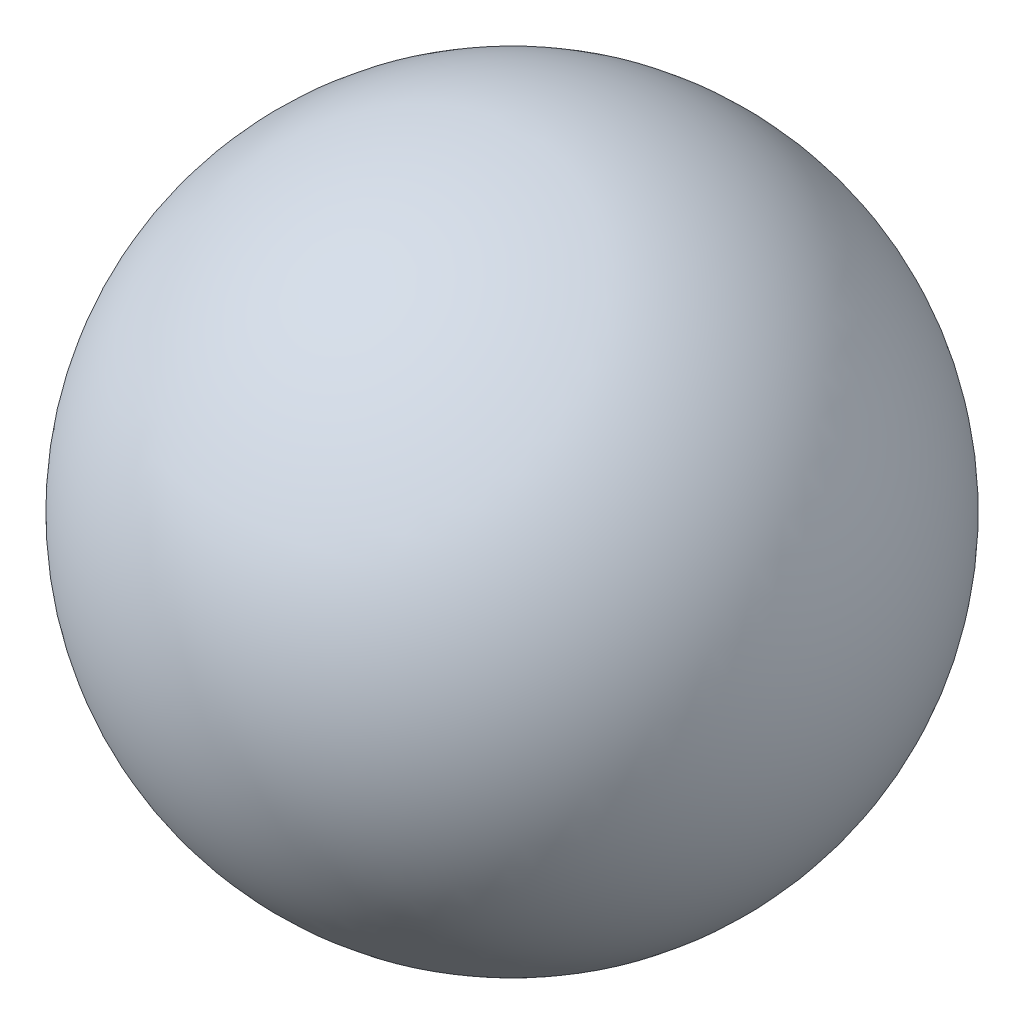
ISO-10303-21;
HEADER;
FILE_DESCRIPTION(('STEP AP214'),'2;1');
FILE_NAME('part.step','',(''),(''),'','','');
FILE_SCHEMA(('AUTOMOTIVE_DESIGN { 1 0 10303 214 1 1 1 1 }'));
ENDSEC;
DATA;
#1=APPLICATION_CONTEXT('core data for automotive mechanical design processes');
#2=APPLICATION_PROTOCOL_DEFINITION('international standard','automotive_design',2000,#1);
#3=PRODUCT_CONTEXT('',#1,'mechanical');
#4=PRODUCT('Part','Part','',(#3));
#5=PRODUCT_RELATED_PRODUCT_CATEGORY('part','',(#4));
#6=PRODUCT_DEFINITION_FORMATION('','',#4);
#7=PRODUCT_DEFINITION_CONTEXT('part definition',#1,'design');
#8=PRODUCT_DEFINITION('design','',#6,#7);
#9=PRODUCT_DEFINITION_SHAPE('','',#8);
#10=(LENGTH_UNIT() NAMED_UNIT(*) SI_UNIT(.MILLI.,.METRE.));
#11=(NAMED_UNIT(*) PLANE_ANGLE_UNIT() SI_UNIT($,.RADIAN.));
#12=(NAMED_UNIT(*) SI_UNIT($,.STERADIAN.) SOLID_ANGLE_UNIT());
#13=UNCERTAINTY_MEASURE_WITH_UNIT(LENGTH_MEASURE(1.E-05),#10,'distance_accuracy_value','');
#14=(GEOMETRIC_REPRESENTATION_CONTEXT(3) GLOBAL_UNCERTAINTY_ASSIGNED_CONTEXT((#13)) GLOBAL_UNIT_ASSIGNED_CONTEXT((#10,
#11,#12)) REPRESENTATION_CONTEXT('',''));
#15=CARTESIAN_POINT('',(0.,0.,0.));
#16=DIRECTION('',(0.,0.,1.));
#17=DIRECTION('',(1.,0.,0.));
#18=AXIS2_PLACEMENT_3D('',#15,#16,#17);
#19=CARTESIAN_POINT('',(0.,0.,0.));
#20=DIRECTION('',(0.,1.,0.));
#21=DIRECTION('',(-1.,0.,0.));
#22=AXIS2_PLACEMENT_3D('',#19,#20,#21);
#23=SPHERICAL_SURFACE('',#22,31.75);
#24=CARTESIAN_POINT('',(0.,31.75,0.));
#25=VERTEX_POINT('',#24);
#26=VERTEX_LOOP('',#25);
#27=FACE_BOUND('',#26,.T.);
#28=ADVANCED_FACE('F39',(#27),#23,.T.);
#29=CLOSED_SHELL('',(#28));
#30=CARTESIAN_POINT('',(0.,0.,0.));
#31=DIRECTION('',(0.,1.,0.));
#32=DIRECTION('',(1.,0.,0.));
#33=AXIS2_PLACEMENT_3D('',#30,#31,#32);
#34=SPHERICAL_SURFACE('',#33,29.75);
#35=CARTESIAN_POINT('',(0.,-29.6826969798905,0.));
#36=DIRECTION('',(0.,1.,0.));
#37=DIRECTION('',(0.,0.,1.));
#38=AXIS2_PLACEMENT_3D('',#35,#36,#37);
#39=CIRCLE('',#38,2.);
#40=CARTESIAN_POINT('',(1.99999999999997,-29.6826969798905,0.));
#41=VERTEX_POINT('',#40);
#42=EDGE_CURVE('E10',#41,#41,#39,.T.);
#43=CARTESIAN_POINT('',(0.,29.6826969798905,0.));
#44=DIRECTION('',(0.,1.,0.));
#45=DIRECTION('',(0.,0.,1.));
#46=AXIS2_PLACEMENT_3D('',#43,#44,#45);
#47=CIRCLE('',#46,2.);
#48=CARTESIAN_POINT('',(2.00000000000002,29.6826969798905,0.));
#49=VERTEX_POINT('',#48);
#50=EDGE_CURVE('E48',#49,#49,#47,.T.);
#51=CARTESIAN_POINT('',(1.99999999999997,-29.6826969798905,0.));
#52=CARTESIAN_POINT('',(2.46488107904726,-29.6513822957577,0.));
#53=CARTESIAN_POINT('',(2.92902444691522,-29.6091294837531,0.));
#54=CARTESIAN_POINT('',(3.85481565627678,-29.5028787163945,0.));
#55=CARTESIAN_POINT('',(4.31646349777039,-29.4388807610405,0.));
#56=CARTESIAN_POINT('',(5.23624355036759,-29.2892708193767,0.));
#57=CARTESIAN_POINT('',(5.69437576147119,-29.2036588330671,0.));
#58=CARTESIAN_POINT('',(6.60611368478757,-29.0110125082922,0.));
#59=CARTESIAN_POINT('',(7.05971939700036,-28.9039781698269,0.));
#60=CARTESIAN_POINT('',(7.96140304937135,-28.6687226566161,0.));
#61=CARTESIAN_POINT('',(8.40948098952956,-28.5405014818704,0.));
#62=CARTESIAN_POINT('',(9.29912013138103,-28.2631554984727,0.));
#63=CARTESIAN_POINT('',(9.74068133307429,-28.1140306898207,0.));
#64=CARTESIAN_POINT('',(10.6163123868093,-27.7952065316673,0.));
#65=CARTESIAN_POINT('',(11.0503822388511,-27.6255071821661,0.));
#66=CARTESIAN_POINT('',(11.9100725244638,-27.2659085133849,0.));
#67=CARTESIAN_POINT('',(12.3356929580348,-27.0760091941049,0.));
#68=CARTESIAN_POINT('',(13.1775449852382,-26.6764297240496,0.));
#69=CARTESIAN_POINT('',(13.5937765788706,-26.4667495732742,0.));
#70=CARTESIAN_POINT('',(14.4159322281379,-26.028071243132,0.));
#71=CARTESIAN_POINT('',(14.8218562837727,-25.7990730637653,0.));
#72=CARTESIAN_POINT('',(15.6225009094343,-25.3222641164418,0.));
#73=CARTESIAN_POINT('',(16.017221479461,-25.074453348485,0.));
#74=CARTESIAN_POINT('',(16.7945879144477,-24.560566187099,0.));
#75=CARTESIAN_POINT('',(17.1772337794077,-24.2944897936699,0.));
#76=CARTESIAN_POINT('',(17.9296062358432,-23.7446586598943,0.));
#77=CARTESIAN_POINT('',(18.2993328273186,-23.4609039195479,0.));
#78=CARTESIAN_POINT('',(19.0250506835356,-22.8763423898162,0.));
#79=CARTESIAN_POINT('',(19.3810419482773,-22.5755356004311,0.));
#80=CARTESIAN_POINT('',(20.0785034141195,-21.9575339074408,0.));
#81=CARTESIAN_POINT('',(20.4199736152201,-21.6403390038357,0.));
#82=CARTESIAN_POINT('',(21.0876392674788,-20.9902611887491,0.));
#83=CARTESIAN_POINT('',(21.4138347186368,-20.6573782772675,0.));
#84=CARTESIAN_POINT('',(22.0502308988361,-19.9766591790327,0.));
#85=CARTESIAN_POINT('',(22.3604316278774,-19.6288229922795,0.));
#86=CARTESIAN_POINT('',(22.9641536949042,-18.9189650806813,0.));
#87=CARTESIAN_POINT('',(23.2576750328898,-18.5569433558362,0.));
#88=CARTESIAN_POINT('',(23.8273904632901,-17.819513415274,0.));
#89=CARTESIAN_POINT('',(24.1035845557048,-17.4441051995568,0.));
#90=CARTESIAN_POINT('',(24.638035884803,-16.6807308708694,0.));
#91=CARTESIAN_POINT('',(24.8962931214866,-16.2927647578991,0.));
#92=CARTESIAN_POINT('',(25.3943007188368,-15.5051309458676,0.));
#93=CARTESIAN_POINT('',(25.6340510795036,-15.1054632468065,0.));
#94=CARTESIAN_POINT('',(26.0945157525469,-14.2953084012659,0.));
#95=CARTESIAN_POINT('',(26.3152300649234,-13.8848212547864,0.));
#96=CARTESIAN_POINT('',(26.7371354851038,-13.0539335335531,0.));
#97=CARTESIAN_POINT('',(26.9383265929076,-12.6335329587993,0.));
#98=CARTESIAN_POINT('',(27.3207415388923,-11.7837462808846,0.));
#99=CARTESIAN_POINT('',(27.5019653770733,-11.3543601777238,0.));
#100=CARTESIAN_POINT('',(27.8440457901266,-10.4875501755439,0.));
#101=CARTESIAN_POINT('',(28.004902364999,-10.0501262765248,0.));
#102=CARTESIAN_POINT('',(28.3058932119715,-9.16820615604193,0.));
#103=CARTESIAN_POINT('',(28.4460274840717,-8.72370993457809,0.));
#104=CARTESIAN_POINT('',(28.705264423895,-7.82862625250984,0.));
#105=CARTESIAN_POINT('',(28.8243670916181,-7.37803879190543,0.));
#106=CARTESIAN_POINT('',(29.0412779416251,-6.47176715932333,0.));
#107=CARTESIAN_POINT('',(29.1390861239091,-6.01608298734563,0.));
#108=CARTESIAN_POINT('',(29.3131921227444,-5.10062370914514,0.));
#109=CARTESIAN_POINT('',(29.3894899392959,-4.64084860292236,0.));
#110=CARTESIAN_POINT('',(29.5204068036285,-3.71822226278941,0.));
#111=CARTESIAN_POINT('',(29.5750258514097,-3.25537102887925,0.));
#112=CARTESIAN_POINT('',(29.6624646241155,-2.32761402949767,0.));
#113=CARTESIAN_POINT('',(29.6952843490401,-1.86270826402625,0.));
#114=CARTESIAN_POINT('',(29.7390520369824,-0.931868332369899,0.));
#115=CARTESIAN_POINT('',(29.75,-0.465934166184962,0.));
#116=CARTESIAN_POINT('',(29.75,0.46593416618491,0.));
#117=CARTESIAN_POINT('',(29.7390520369824,0.931868332369846,0.));
#118=CARTESIAN_POINT('',(29.6952843490401,1.8627082640262,0.));
#119=CARTESIAN_POINT('',(29.6624646241155,2.32761402949761,0.));
#120=CARTESIAN_POINT('',(29.5750258514097,3.25537102887919,0.));
#121=CARTESIAN_POINT('',(29.5204068036285,3.71822226278936,0.));
#122=CARTESIAN_POINT('',(29.3894899392959,4.64084860292231,0.));
#123=CARTESIAN_POINT('',(29.3131921227444,5.10062370914509,0.));
#124=CARTESIAN_POINT('',(29.1390861239091,6.01608298734557,0.));
#125=CARTESIAN_POINT('',(29.0412779416252,6.47176715932328,0.));
#126=CARTESIAN_POINT('',(28.8243670916181,7.37803879190538,0.));
#127=CARTESIAN_POINT('',(28.705264423895,7.82862625250979,0.));
#128=CARTESIAN_POINT('',(28.4460274840717,8.72370993457804,0.));
#129=CARTESIAN_POINT('',(28.3058932119715,9.16820615604188,0.));
#130=CARTESIAN_POINT('',(28.004902364999,10.0501262765248,0.));
#131=CARTESIAN_POINT('',(27.8440457901266,10.4875501755438,0.));
#132=CARTESIAN_POINT('',(27.5019653770733,11.3543601777237,0.));
#133=CARTESIAN_POINT('',(27.3207415388924,11.7837462808845,0.));
#134=CARTESIAN_POINT('',(26.9383265929076,12.6335329587992,0.));
#135=CARTESIAN_POINT('',(26.7371354851038,13.0539335335531,0.));
#136=CARTESIAN_POINT('',(26.3152300649235,13.8848212547864,0.));
#137=CARTESIAN_POINT('',(26.0945157525469,14.2953084012658,0.));
#138=CARTESIAN_POINT('',(25.6340510795036,15.1054632468064,0.));
#139=CARTESIAN_POINT('',(25.3943007188368,15.5051309458676,0.));
#140=CARTESIAN_POINT('',(24.8962931214866,16.2927647578991,0.));
#141=CARTESIAN_POINT('',(24.6380358848031,16.6807308708694,0.));
#142=CARTESIAN_POINT('',(24.1035845557049,17.4441051995568,0.));
#143=CARTESIAN_POINT('',(23.8273904632902,17.8195134152739,0.));
#144=CARTESIAN_POINT('',(23.2576750328899,18.5569433558361,0.));
#145=CARTESIAN_POINT('',(22.9641536949042,18.9189650806812,0.));
#146=CARTESIAN_POINT('',(22.3604316278774,19.6288229922795,0.));
#147=CARTESIAN_POINT('',(22.0502308988362,19.9766591790327,0.));
#148=CARTESIAN_POINT('',(21.4138347186369,20.6573782772674,0.));
#149=CARTESIAN_POINT('',(21.0876392674788,20.990261188749,0.));
#150=CARTESIAN_POINT('',(20.4199736152202,21.6403390038357,0.));
#151=CARTESIAN_POINT('',(20.0785034141196,21.9575339074408,0.));
#152=CARTESIAN_POINT('',(19.3810419482773,22.575535600431,0.));
#153=CARTESIAN_POINT('',(19.0250506835357,22.8763423898162,0.));
#154=CARTESIAN_POINT('',(18.2993328273186,23.4609039195478,0.));
#155=CARTESIAN_POINT('',(17.9296062358432,23.7446586598943,0.));
#156=CARTESIAN_POINT('',(17.1772337794078,24.2944897936699,0.));
#157=CARTESIAN_POINT('',(16.7945879144478,24.560566187099,0.));
#158=CARTESIAN_POINT('',(16.017221479461,25.0744533484849,0.));
#159=CARTESIAN_POINT('',(15.6225009094343,25.3222641164418,0.));
#160=CARTESIAN_POINT('',(14.8218562837728,25.7990730637653,0.));
#161=CARTESIAN_POINT('',(14.4159322281379,26.028071243132,0.));
#162=CARTESIAN_POINT('',(13.5937765788707,26.4667495732741,0.));
#163=CARTESIAN_POINT('',(13.1775449852383,26.6764297240496,0.));
#164=CARTESIAN_POINT('',(12.3356929580349,27.0760091941049,0.));
#165=CARTESIAN_POINT('',(11.9100725244639,27.2659085133848,0.));
#166=CARTESIAN_POINT('',(11.0503822388511,27.625507182166,0.));
#167=CARTESIAN_POINT('',(10.6163123868094,27.7952065316673,0.));
#168=CARTESIAN_POINT('',(9.74068133307434,28.1140306898207,0.));
#169=CARTESIAN_POINT('',(9.29912013138108,28.2631554984727,0.));
#170=CARTESIAN_POINT('',(8.40948098952961,28.5405014818704,0.));
#171=CARTESIAN_POINT('',(7.9614030493714,28.668722656616,0.));
#172=CARTESIAN_POINT('',(7.05971939700041,28.9039781698269,0.));
#173=CARTESIAN_POINT('',(6.60611368478763,29.0110125082922,0.));
#174=CARTESIAN_POINT('',(5.69437576147125,29.2036588330671,0.));
#175=CARTESIAN_POINT('',(5.23624355036764,29.2892708193767,0.));
#176=CARTESIAN_POINT('',(4.31646349777043,29.4388807610404,0.));
#177=CARTESIAN_POINT('',(3.85481565627683,29.5028787163945,0.));
#178=CARTESIAN_POINT('',(2.92902444691527,29.6091294837531,0.));
#179=CARTESIAN_POINT('',(2.46488107904732,29.6513822957577,0.));
#180=CARTESIAN_POINT('',(2.00000000000002,29.6826969798905,0.));
#181=B_SPLINE_CURVE_WITH_KNOTS('',3,(#51,#52,#53,#54,#55,#56,#57,#58,#59,#60,#61,#62,#63,#64,
#65,#66,#67,#68,#69,#70,#71,#72,#73,#74,#75,#76,#77,#78,#79,#80,#81,#82,#83,#84,#85,#86,#87,#88,
#89,#90,#91,#92,#93,#94,#95,#96,#97,#98,#99,#100,#101,#102,#103,#104,#105,#106,#107,#108,#109,
#110,#111,#112,#113,#114,#115,#116,#117,#118,#119,#120,#121,#122,#123,#124,#125,#126,#127,#128,
#129,#130,#131,#132,#133,#134,#135,#136,#137,#138,#139,#140,#141,#142,#143,#144,#145,#146,#147,
#148,#149,#150,#151,#152,#153,#154,#155,#156,#157,#158,#159,#160,#161,#162,#163,#164,#165,#166,
#167,#168,#169,#170,#171,#172,#173,#174,#175,#176,#177,#178,#179,#180),.UNSPECIFIED.,.F.,.F.,(4,
2,2,2,2,2,2,2,2,2,2,2,2,2,2,2,2,2,2,2,2,2,2,2,2,2,2,2,2,2,2,2,2,2,2,2,2,2,2,2,2,2,2,2,2,2,2,2,2,
2,2,2,2,2,2,2,2,2,2,2,2,2,2,2,4),(0.,1.39767396621363,2.79534793242727,4.1930218986409,
5.59069586485453,6.98836983106817,8.3860437972818,9.78371776349543,11.1813917297091,
12.5790656959227,13.9767396621363,15.37441362835,16.7720875945636,18.1697615607772,
19.5674355269909,20.9651094932045,22.3627834594181,23.7604574256318,25.1581313918454,
26.555805358059,27.9534793242727,29.3511532904863,30.7488272566999,32.1465012229136,
33.5441751891272,34.9418491553408,36.3395231215545,37.7371970877681,39.1348710539817,
40.5325450201954,41.930218986409,43.3278929526226,44.7255669188363,46.1232408850499,
47.5209148512635,48.9185888174772,50.3162627836908,51.7139367499044,53.1116107161181,
54.5092846823317,55.9069586485453,57.304632614759,58.7023065809726,60.0999805471862,
61.4976545133999,62.8953284796135,64.2930024458271,65.6906764120408,67.0883503782544,
68.486024344468,69.8836983106817,71.2813722768953,72.6790462431089,74.0767202093226,
75.4743941755362,76.8720681417498,78.2697421079635,79.6674160741771,81.0650900403907,
82.4627640066044,83.860437972818,85.2581119390316,86.6557859052453,88.0534598714589,
89.4511338376725),.UNSPECIFIED.);
#182=EDGE_CURVE('BSEAM41',#41,#49,#181,.T.);
#183=ORIENTED_EDGE('',*,*,#42,.F.);
#184=ORIENTED_EDGE('',*,*,#50,.T.);
#185=ORIENTED_EDGE('',*,*,#182,.T.);
#186=ORIENTED_EDGE('',*,*,#182,.F.);
#187=EDGE_LOOP('',(#183,#185,#184,#186));
#188=FACE_BOUND('',#187,.T.);
#189=ADVANCED_FACE('F41',(#188),#34,.F.);
#190=CARTESIAN_POINT('',(0.,-29.6826969798905,0.));
#191=DIRECTION('',(0.,-1.,0.));
#192=DIRECTION('',(0.,0.,-1.));
#193=AXIS2_PLACEMENT_3D('',#190,#191,#192);
#194=PLANE('',#193);
#195=ORIENTED_EDGE('',*,*,#42,.T.);
#196=EDGE_LOOP('',(#195));
#197=FACE_BOUND('',#196,.T.);
#198=ADVANCED_FACE('F58',(#197),#194,.F.);
#199=CARTESIAN_POINT('',(0.,29.6826969798905,0.));
#200=DIRECTION('',(0.,1.,0.));
#201=DIRECTION('',(0.,0.,1.));
#202=AXIS2_PLACEMENT_3D('',#199,#200,#201);
#203=PLANE('',#202);
#204=ORIENTED_EDGE('',*,*,#50,.F.);
#205=EDGE_LOOP('',(#204));
#206=FACE_BOUND('',#205,.T.);
#207=ADVANCED_FACE('F56',(#206),#203,.F.);
#208=CLOSED_SHELL('',(#189,#198,#207));
#209=ORIENTED_CLOSED_SHELL('',*,#208,.T.);
#210=BREP_WITH_VOIDS('B2',#29,(#209));
#211=ADVANCED_BREP_SHAPE_REPRESENTATION('',(#18,#210),#14);
#212=SHAPE_DEFINITION_REPRESENTATION(#9,#211);
ENDSEC;
END-ISO-10303-21;
